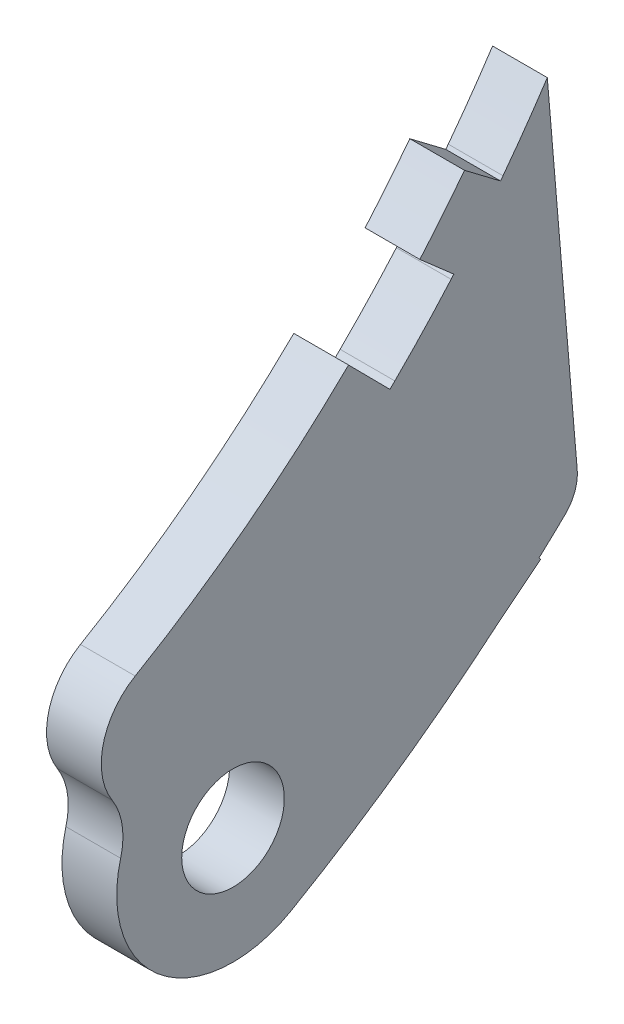
ISO-10303-21;
HEADER;
FILE_DESCRIPTION(('STEP AP214'),'2;1');
FILE_NAME('part.step','',(''),(''),'','','');
FILE_SCHEMA(('AUTOMOTIVE_DESIGN { 1 0 10303 214 1 1 1 1 }'));
ENDSEC;
DATA;
#1=APPLICATION_CONTEXT('core data for automotive mechanical design processes');
#2=APPLICATION_PROTOCOL_DEFINITION('international standard','automotive_design',2000,#1);
#3=PRODUCT_CONTEXT('',#1,'mechanical');
#4=PRODUCT('Part','Part','',(#3));
#5=PRODUCT_RELATED_PRODUCT_CATEGORY('part','',(#4));
#6=PRODUCT_DEFINITION_FORMATION('','',#4);
#7=PRODUCT_DEFINITION_CONTEXT('part definition',#1,'design');
#8=PRODUCT_DEFINITION('design','',#6,#7);
#9=PRODUCT_DEFINITION_SHAPE('','',#8);
#10=(LENGTH_UNIT() NAMED_UNIT(*) SI_UNIT(.MILLI.,.METRE.));
#11=(NAMED_UNIT(*) PLANE_ANGLE_UNIT() SI_UNIT($,.RADIAN.));
#12=(NAMED_UNIT(*) SI_UNIT($,.STERADIAN.) SOLID_ANGLE_UNIT());
#13=UNCERTAINTY_MEASURE_WITH_UNIT(LENGTH_MEASURE(1.E-05),#10,'distance_accuracy_value','');
#14=(GEOMETRIC_REPRESENTATION_CONTEXT(3) GLOBAL_UNCERTAINTY_ASSIGNED_CONTEXT((#13)) GLOBAL_UNIT_ASSIGNED_CONTEXT((#10,
#11,#12)) REPRESENTATION_CONTEXT('',''));
#15=CARTESIAN_POINT('',(0.,0.,0.));
#16=DIRECTION('',(0.,0.,1.));
#17=DIRECTION('',(1.,0.,0.));
#18=AXIS2_PLACEMENT_3D('',#15,#16,#17);
#19=CARTESIAN_POINT('',(-286.81,-73.3959378367008,-42.8723256783574));
#20=DIRECTION('',(1.,0.,0.));
#21=DIRECTION('',(0.,0.,-1.));
#22=AXIS2_PLACEMENT_3D('',#19,#20,#21);
#23=CYLINDRICAL_SURFACE('',#22,5.);
#24=CARTESIAN_POINT('',(-282.81,-73.3959378367008,-42.8723256783574));
#25=DIRECTION('',(-1.,0.,0.));
#26=DIRECTION('',(0.,0.,1.));
#27=AXIS2_PLACEMENT_3D('',#24,#25,#26);
#28=CIRCLE('',#27,5.);
#29=CARTESIAN_POINT('',(-282.81,-76.0957327643658,-38.6638690314909));
#30=VERTEX_POINT('',#29);
#31=CARTESIAN_POINT('',(-282.81,-69.0785297286596,-40.3504241678658));
#32=VERTEX_POINT('',#31);
#33=EDGE_CURVE('E290',#30,#32,#28,.T.);
#34=ORIENTED_EDGE('',*,*,#33,.T.);
#35=DIRECTION('',(1.,0.,0.));
#36=VECTOR('',#35,1.);
#37=CARTESIAN_POINT('',(-286.81,-69.0785297286596,-40.3504241678658));
#38=LINE('',#37,#36);
#39=CARTESIAN_POINT('',(-286.81,-69.0785297286596,-40.3504241678658));
#40=VERTEX_POINT('',#39);
#41=EDGE_CURVE('E314',#40,#32,#38,.T.);
#42=ORIENTED_EDGE('',*,*,#41,.F.);
#43=CARTESIAN_POINT('',(-286.81,-73.3959378367008,-42.8723256783574));
#44=DIRECTION('',(-1.,0.,0.));
#45=DIRECTION('',(0.,0.,1.));
#46=AXIS2_PLACEMENT_3D('',#43,#44,#45);
#47=CIRCLE('',#46,5.);
#48=CARTESIAN_POINT('',(-286.81,-76.0957327643658,-38.663869031491));
#49=VERTEX_POINT('',#48);
#50=EDGE_CURVE('E284',#49,#40,#47,.T.);
#51=ORIENTED_EDGE('',*,*,#50,.F.);
#52=DIRECTION('',(1.,0.,0.));
#53=VECTOR('',#52,1.);
#54=CARTESIAN_POINT('',(-286.81,-76.0957327643658,-38.663869031491));
#55=LINE('',#54,#53);
#56=EDGE_CURVE('E305',#49,#30,#55,.T.);
#57=ORIENTED_EDGE('',*,*,#56,.T.);
#58=EDGE_LOOP('',(#34,#42,#51,#57));
#59=FACE_BOUND('',#58,.T.);
#60=ADVANCED_FACE('F34',(#59),#23,.T.);
#61=CARTESIAN_POINT('',(-286.81,-78.7955276920308,-34.4554123846245));
#62=DIRECTION('',(1.,0.,0.));
#63=DIRECTION('',(0.,0.,-1.));
#64=AXIS2_PLACEMENT_3D('',#61,#62,#63);
#65=CYLINDRICAL_SURFACE('',#64,5.);
#66=CARTESIAN_POINT('',(-282.81,-78.7955276920308,-34.4554123846245));
#67=DIRECTION('',(1.,0.,0.));
#68=DIRECTION('',(0.,0.,1.));
#69=AXIS2_PLACEMENT_3D('',#66,#67,#68);
#70=CIRCLE('',#69,5.);
#71=CARTESIAN_POINT('',(-282.81,-80.0832631244349,-39.2867411310597));
#72=VERTEX_POINT('',#71);
#73=EDGE_CURVE('E235',#72,#30,#70,.T.);
#74=ORIENTED_EDGE('',*,*,#73,.T.);
#75=ORIENTED_EDGE('',*,*,#56,.F.);
#76=CARTESIAN_POINT('',(-286.81,-78.7955276920308,-34.4554123846245));
#77=DIRECTION('',(1.,0.,0.));
#78=DIRECTION('',(0.,0.,1.));
#79=AXIS2_PLACEMENT_3D('',#76,#77,#78);
#80=CIRCLE('',#79,5.);
#81=CARTESIAN_POINT('',(-286.81,-80.0832631244349,-39.2867411310597));
#82=VERTEX_POINT('',#81);
#83=EDGE_CURVE('E287',#82,#49,#80,.T.);
#84=ORIENTED_EDGE('',*,*,#83,.F.);
#85=DIRECTION('',(1.,0.,0.));
#86=VECTOR('',#85,1.);
#87=CARTESIAN_POINT('',(-286.81,-80.0832631244349,-39.2867411310597));
#88=LINE('',#87,#86);
#89=EDGE_CURVE('E239',#82,#72,#88,.T.);
#90=ORIENTED_EDGE('',*,*,#89,.T.);
#91=EDGE_LOOP('',(#74,#75,#84,#90));
#92=FACE_BOUND('',#91,.T.);
#93=ADVANCED_FACE('F306',(#92),#65,.F.);
#94=CARTESIAN_POINT('',(-286.81,-82.272413359522,-47.4999999999995));
#95=DIRECTION('',(1.,0.,0.));
#96=DIRECTION('',(0.,0.,-1.));
#97=AXIS2_PLACEMENT_3D('',#94,#95,#96);
#98=CYLINDRICAL_SURFACE('',#97,8.50000000000001);
#99=CARTESIAN_POINT('',(-282.81,-82.272413359522,-47.4999999999995));
#100=DIRECTION('',(-1.,0.,0.));
#101=DIRECTION('',(0.,0.,1.));
#102=AXIS2_PLACEMENT_3D('',#99,#100,#101);
#103=CIRCLE('',#102,8.50000000000001);
#104=CARTESIAN_POINT('',(-282.81,-89.6336292916897,-51.7499999999995));
#105=VERTEX_POINT('',#104);
#106=EDGE_CURVE('E332',#105,#72,#103,.T.);
#107=ORIENTED_EDGE('',*,*,#106,.T.);
#108=ORIENTED_EDGE('',*,*,#89,.F.);
#109=CARTESIAN_POINT('',(-286.81,-82.272413359522,-47.4999999999995));
#110=DIRECTION('',(-1.,0.,0.));
#111=DIRECTION('',(0.,0.,1.));
#112=AXIS2_PLACEMENT_3D('',#109,#110,#111);
#113=CIRCLE('',#112,8.50000000000001);
#114=CARTESIAN_POINT('',(-286.81,-89.6336292916897,-51.7499999999995));
#115=VERTEX_POINT('',#114);
#116=EDGE_CURVE('E294',#115,#82,#113,.T.);
#117=ORIENTED_EDGE('',*,*,#116,.F.);
#118=DIRECTION('',(1.,0.,0.));
#119=VECTOR('',#118,1.);
#120=CARTESIAN_POINT('',(-286.81,-89.6336292916897,-51.7499999999995));
#121=LINE('',#120,#119);
#122=EDGE_CURVE('E323',#115,#105,#121,.T.);
#123=ORIENTED_EDGE('',*,*,#122,.T.);
#124=EDGE_LOOP('',(#107,#108,#117,#123));
#125=FACE_BOUND('',#124,.T.);
#126=ADVANCED_FACE('F396',(#125),#98,.T.);
#127=CARTESIAN_POINT('',(-286.81,0.,0.));
#128=DIRECTION('',(1.,0.,0.));
#129=DIRECTION('',(0.,0.,-1.));
#130=AXIS2_PLACEMENT_3D('',#127,#128,#129);
#131=CYLINDRICAL_SURFACE('',#130,103.5);
#132=DIRECTION('',(-1.,0.,0.));
#133=VECTOR('',#132,1.);
#134=CARTESIAN_POINT('',(-258.7,-79.0062920010245,-66.8599717637455));
#135=LINE('',#134,#133);
#136=CARTESIAN_POINT('',(-282.81,-79.006292001024,-66.8599717637463));
#137=VERTEX_POINT('',#136);
#138=CARTESIAN_POINT('',(-286.81,-79.006292001024,-66.8599717637463));
#139=VERTEX_POINT('',#138);
#140=EDGE_CURVE('E225',#137,#139,#135,.T.);
#141=ORIENTED_EDGE('',*,*,#140,.F.);
#142=CARTESIAN_POINT('',(-282.81,0.,0.));
#143=DIRECTION('',(-1.,0.,0.));
#144=DIRECTION('',(0.,0.,1.));
#145=AXIS2_PLACEMENT_3D('',#142,#143,#144);
#146=CIRCLE('',#145,103.5);
#147=EDGE_CURVE('E331',#137,#105,#146,.T.);
#148=ORIENTED_EDGE('',*,*,#147,.T.);
#149=ORIENTED_EDGE('',*,*,#122,.F.);
#150=CARTESIAN_POINT('',(-286.81,0.,0.));
#151=DIRECTION('',(-1.,0.,0.));
#152=DIRECTION('',(0.,0.,1.));
#153=AXIS2_PLACEMENT_3D('',#150,#151,#152);
#154=CIRCLE('',#153,103.5);
#155=EDGE_CURVE('E248',#139,#115,#154,.T.);
#156=ORIENTED_EDGE('',*,*,#155,.F.);
#157=EDGE_LOOP('',(#141,#148,#149,#156));
#158=FACE_BOUND('',#157,.T.);
#159=ADVANCED_FACE('F376',(#158),#131,.T.);
#160=CARTESIAN_POINT('',(-392.796966999625,-76.5119213000356,-69.9869694941648));
#161=DIRECTION('',(0.,-0.781749432604839,-0.623592675247243));
#162=DIRECTION('',(0.,0.623592675247243,-0.781749432604839));
#163=AXIS2_PLACEMENT_3D('',#160,#161,#162);
#164=PLANE('',#163);
#165=DIRECTION('',(0.,-0.623592675247243,0.781749432604839));
#166=VECTOR('',#165,1.);
#167=CARTESIAN_POINT('',(-282.81,-79.9487386232164,-65.6785000412519));
#168=LINE('',#167,#166);
#169=CARTESIAN_POINT('',(-282.81,-76.5119213000357,-69.9869694941649));
#170=VERTEX_POINT('',#169);
#171=EDGE_CURVE('E251',#137,#170,#168,.F.);
#172=ORIENTED_EDGE('',*,*,#171,.F.);
#173=ORIENTED_EDGE('',*,*,#140,.T.);
#174=DIRECTION('',(0.,-0.623592675247243,0.781749432604839));
#175=VECTOR('',#174,1.);
#176=CARTESIAN_POINT('',(-286.81,-75.2647359495412,-71.5504683593746));
#177=LINE('',#176,#175);
#178=CARTESIAN_POINT('',(-286.81,-76.5119213000357,-69.9869694941649));
#179=VERTEX_POINT('',#178);
#180=EDGE_CURVE('E245',#179,#139,#177,.T.);
#181=ORIENTED_EDGE('',*,*,#180,.F.);
#182=DIRECTION('',(1.,0.,0.));
#183=VECTOR('',#182,1.);
#184=CARTESIAN_POINT('',(-392.796966999625,-76.5119213000356,-69.9869694941648));
#185=LINE('',#184,#183);
#186=EDGE_CURVE('E227',#179,#170,#185,.T.);
#187=ORIENTED_EDGE('',*,*,#186,.T.);
#188=EDGE_LOOP('',(#172,#173,#181,#187));
#189=FACE_BOUND('',#188,.T.);
#190=ADVANCED_FACE('F372',(#189),#164,.T.);
#191=CARTESIAN_POINT('',(-392.796966999625,-61.073396129291,-57.6718326848965));
#192=DIRECTION('',(0.,0.623592675247241,-0.781749432604841));
#193=DIRECTION('',(0.,0.781749432604841,0.623592675247241));
#194=AXIS2_PLACEMENT_3D('',#191,#192,#193);
#195=PLANE('',#194);
#196=DIRECTION('',(0.,0.781749432604841,0.623592675247241));
#197=VECTOR('',#196,1.);
#198=CARTESIAN_POINT('',(-282.81,-61.073396129291,-57.6718326848965));
#199=LINE('',#198,#197);
#200=CARTESIAN_POINT('',(-282.81,-76.3606536483423,-69.8663050003212));
#201=VERTEX_POINT('',#200);
#202=EDGE_CURVE('E192',#170,#201,#199,.T.);
#203=ORIENTED_EDGE('',*,*,#202,.F.);
#204=ORIENTED_EDGE('',*,*,#186,.F.);
#205=DIRECTION('',(0.,-0.781749432604841,-0.623592675247241));
#206=VECTOR('',#205,1.);
#207=CARTESIAN_POINT('',(-286.81,-61.073396129291,-57.6718326848965));
#208=LINE('',#207,#206);
#209=CARTESIAN_POINT('',(-286.81,-76.3606536483423,-69.8663050003212));
#210=VERTEX_POINT('',#209);
#211=EDGE_CURVE('E243',#210,#179,#208,.T.);
#212=ORIENTED_EDGE('',*,*,#211,.F.);
#213=DIRECTION('',(1.,0.,0.));
#214=VECTOR('',#213,1.);
#215=CARTESIAN_POINT('',(-286.81,-76.3606536483423,-69.8663050003212));
#216=LINE('',#215,#214);
#217=EDGE_CURVE('E228',#210,#201,#216,.T.);
#218=ORIENTED_EDGE('',*,*,#217,.T.);
#219=EDGE_LOOP('',(#203,#204,#212,#218));
#220=FACE_BOUND('',#219,.T.);
#221=ADVANCED_FACE('F370',(#220),#195,.T.);
#222=CARTESIAN_POINT('',(-286.81,-74.5965886279196,-71.7467697187612));
#223=VERTEX_POINT('',#222);
#224=EDGE_CURVE('E246',#223,#210,#154,.T.);
#225=ORIENTED_EDGE('',*,*,#224,.F.);
#226=DIRECTION('',(1.,0.,0.));
#227=VECTOR('',#226,1.);
#228=CARTESIAN_POINT('',(-286.81,-74.5965886279196,-71.7467697187611));
#229=LINE('',#228,#227);
#230=CARTESIAN_POINT('',(-282.81,-74.5965886279196,-71.7467697187612));
#231=VERTEX_POINT('',#230);
#232=EDGE_CURVE('E311',#223,#231,#229,.T.);
#233=ORIENTED_EDGE('',*,*,#232,.T.);
#234=EDGE_CURVE('E329',#231,#201,#146,.T.);
#235=ORIENTED_EDGE('',*,*,#234,.T.);
#236=ORIENTED_EDGE('',*,*,#217,.F.);
#237=EDGE_LOOP('',(#225,#233,#235,#236));
#238=FACE_BOUND('',#237,.T.);
#239=ADVANCED_FACE('F367',(#238),#131,.T.);
#240=CARTESIAN_POINT('',(-286.81,-72.43436866769,-69.6671532051739));
#241=DIRECTION('',(1.,0.,0.));
#242=DIRECTION('',(0.,0.,-1.));
#243=AXIS2_PLACEMENT_3D('',#240,#241,#242);
#244=CYLINDRICAL_SURFACE('',#243,3.);
#245=CARTESIAN_POINT('',(-286.81,-72.43436866769,-69.6671532051739));
#246=DIRECTION('',(1.,0.,0.));
#247=DIRECTION('',(0.,0.,-1.));
#248=AXIS2_PLACEMENT_3D('',#245,#246,#247);
#249=CIRCLE('',#248,3.);
#250=CARTESIAN_POINT('',(-286.81,-72.1822694264871,-72.6565421013506));
#251=VERTEX_POINT('',#250);
#252=EDGE_CURVE('E292',#251,#223,#249,.F.);
#253=ORIENTED_EDGE('',*,*,#252,.F.);
#254=DIRECTION('',(1.,0.,0.));
#255=VECTOR('',#254,1.);
#256=CARTESIAN_POINT('',(-286.81,-72.1822694264871,-72.6565421013506));
#257=LINE('',#256,#255);
#258=CARTESIAN_POINT('',(-282.81,-72.1822694264871,-72.6565421013506));
#259=VERTEX_POINT('',#258);
#260=EDGE_CURVE('E255',#259,#251,#257,.F.);
#261=ORIENTED_EDGE('',*,*,#260,.F.);
#262=CARTESIAN_POINT('',(-282.81,-72.43436866769,-69.6671532051739));
#263=DIRECTION('',(1.,0.,0.));
#264=DIRECTION('',(0.,0.,-1.));
#265=AXIS2_PLACEMENT_3D('',#262,#263,#264);
#266=CIRCLE('',#265,3.);
#267=EDGE_CURVE('E186',#231,#259,#266,.T.);
#268=ORIENTED_EDGE('',*,*,#267,.F.);
#269=ORIENTED_EDGE('',*,*,#232,.F.);
#270=EDGE_LOOP('',(#253,#261,#268,#269));
#271=FACE_BOUND('',#270,.T.);
#272=ADVANCED_FACE('F362',(#271),#244,.T.);
#273=CARTESIAN_POINT('',(-286.81,-45.7781275192469,-70.4298448161826));
#274=DIRECTION('',(0.,-0.0840330804009582,0.996462965392256));
#275=DIRECTION('',(0.,-0.996462965392256,-0.0840330804009582));
#276=AXIS2_PLACEMENT_3D('',#273,#274,#275);
#277=PLANE('',#276);
#278=DIRECTION('',(0.,-0.996462965392256,-0.0840330804009584));
#279=VECTOR('',#278,1.);
#280=CARTESIAN_POINT('',(-286.81,-45.7781275192469,-70.4298448161826));
#281=LINE('',#280,#279);
#282=CARTESIAN_POINT('',(-286.81,-46.2639612951835,-70.4708158408696));
#283=VERTEX_POINT('',#282);
#284=EDGE_CURVE('E258',#283,#251,#281,.T.);
#285=ORIENTED_EDGE('',*,*,#284,.F.);
#286=DIRECTION('',(1.,0.,0.));
#287=VECTOR('',#286,1.);
#288=CARTESIAN_POINT('',(-333.198032184288,-46.2639612951835,-70.4708158408696));
#289=LINE('',#288,#287);
#290=CARTESIAN_POINT('',(-282.81,-46.2639612951835,-70.4708158408696));
#291=VERTEX_POINT('',#290);
#292=EDGE_CURVE('E328',#283,#291,#289,.T.);
#293=ORIENTED_EDGE('',*,*,#292,.T.);
#294=DIRECTION('',(0.,-0.996462965392256,-0.0840330804009584));
#295=VECTOR('',#294,1.);
#296=CARTESIAN_POINT('',(-282.81,-45.7781275192469,-70.4298448161826));
#297=LINE('',#296,#295);
#298=EDGE_CURVE('E326',#291,#259,#297,.T.);
#299=ORIENTED_EDGE('',*,*,#298,.T.);
#300=ORIENTED_EDGE('',*,*,#260,.T.);
#301=EDGE_LOOP('',(#285,#293,#299,#300));
#302=FACE_BOUND('',#301,.T.);
#303=ADVANCED_FACE('F356',(#302),#277,.F.);
#304=CARTESIAN_POINT('',(-333.198032184288,0.,0.));
#305=DIRECTION('',(1.,0.,0.));
#306=DIRECTION('',(0.,0.,-1.));
#307=AXIS2_PLACEMENT_3D('',#304,#305,#306);
#308=CYLINDRICAL_SURFACE('',#307,84.3);
#309=CARTESIAN_POINT('',(-282.81,0.,0.));
#310=DIRECTION('',(1.,0.,0.));
#311=DIRECTION('',(0.,0.,-1.));
#312=AXIS2_PLACEMENT_3D('',#309,#310,#311);
#313=CIRCLE('',#312,84.3);
#314=CARTESIAN_POINT('',(-282.81,-50.8569549756148,-67.2313924488277));
#315=VERTEX_POINT('',#314);
#316=EDGE_CURVE('E224',#315,#291,#313,.T.);
#317=ORIENTED_EDGE('',*,*,#316,.T.);
#318=ORIENTED_EDGE('',*,*,#292,.F.);
#319=CARTESIAN_POINT('',(-286.81,0.,0.));
#320=DIRECTION('',(1.,0.,0.));
#321=DIRECTION('',(0.,0.,-1.));
#322=AXIS2_PLACEMENT_3D('',#319,#320,#321);
#323=CIRCLE('',#322,84.3);
#324=CARTESIAN_POINT('',(-286.81,-50.8569549756145,-67.2313924488279));
#325=VERTEX_POINT('',#324);
#326=EDGE_CURVE('E206',#325,#283,#323,.T.);
#327=ORIENTED_EDGE('',*,*,#326,.F.);
#328=DIRECTION('',(1.,0.,0.));
#329=VECTOR('',#328,1.);
#330=CARTESIAN_POINT('',(-333.198032184288,-50.8569549756148,-67.2313924488277));
#331=LINE('',#330,#329);
#332=EDGE_CURVE('E221',#325,#315,#331,.T.);
#333=ORIENTED_EDGE('',*,*,#332,.T.);
#334=EDGE_LOOP('',(#317,#318,#327,#333));
#335=FACE_BOUND('',#334,.T.);
#336=ADVANCED_FACE('F353',(#335),#308,.F.);
#337=CARTESIAN_POINT('',(-282.51,-51.0962125999876,-67.0504068439325));
#338=DIRECTION('',(0.,-0.603285349651418,-0.797525414576844));
#339=DIRECTION('',(0.,0.797525414576844,-0.603285349651418));
#340=AXIS2_PLACEMENT_3D('',#337,#338,#339);
#341=PLANE('',#340);
#342=DIRECTION('',(0.,0.797525414576844,-0.603285349651418));
#343=VECTOR('',#342,1.);
#344=CARTESIAN_POINT('',(-282.81,-76.9128119041753,-47.5215293268427));
#345=LINE('',#344,#343);
#346=CARTESIAN_POINT('',(-282.81,-51.0962125999876,-67.0504068439325));
#347=VERTEX_POINT('',#346);
#348=EDGE_CURVE('E184',#347,#315,#345,.T.);
#349=ORIENTED_EDGE('',*,*,#348,.T.);
#350=ORIENTED_EDGE('',*,*,#332,.F.);
#351=DIRECTION('',(0.,0.797525414576844,-0.603285349651418));
#352=VECTOR('',#351,1.);
#353=CARTESIAN_POINT('',(-286.81,-76.9128119041753,-47.5215293268427));
#354=LINE('',#353,#352);
#355=CARTESIAN_POINT('',(-286.81,-51.0962125999876,-67.0504068439325));
#356=VERTEX_POINT('',#355);
#357=EDGE_CURVE('E203',#356,#325,#354,.T.);
#358=ORIENTED_EDGE('',*,*,#357,.F.);
#359=DIRECTION('',(-1.,0.,0.));
#360=VECTOR('',#359,1.);
#361=CARTESIAN_POINT('',(-282.51,-51.0962125999876,-67.0504068439325));
#362=LINE('',#361,#360);
#363=EDGE_CURVE('E200',#347,#356,#362,.T.);
#364=ORIENTED_EDGE('',*,*,#363,.F.);
#365=EDGE_LOOP('',(#349,#350,#358,#364));
#366=FACE_BOUND('',#365,.T.);
#367=ADVANCED_FACE('F414',(#366),#341,.F.);
#368=CARTESIAN_POINT('',(0.,-0.23925762437299,0.180985604895482));
#369=DIRECTION('',(0.,0.797525414576844,-0.603285349651419));
#370=DIRECTION('',(0.,0.603285349651419,0.797525414576844));
#371=AXIS2_PLACEMENT_3D('',#368,#369,#370);
#372=PLANE('',#371);
#373=DIRECTION('',(-1.,0.,0.));
#374=VECTOR('',#373,1.);
#375=CARTESIAN_POINT('',(-258.7,-49.1050357864609,-64.4181299046347));
#376=LINE('',#375,#374);
#377=CARTESIAN_POINT('',(-282.81,-49.1050357864609,-64.4181299046347));
#378=VERTEX_POINT('',#377);
#379=CARTESIAN_POINT('',(-286.81,-49.1050357864609,-64.4181299046347));
#380=VERTEX_POINT('',#379);
#381=EDGE_CURVE('E164',#378,#380,#376,.T.);
#382=ORIENTED_EDGE('',*,*,#381,.F.);
#383=DIRECTION('',(0.,0.603285349651419,0.797525414576844));
#384=VECTOR('',#383,1.);
#385=CARTESIAN_POINT('',(-282.81,-47.5793385325131,-62.4012031954472));
#386=LINE('',#385,#384);
#387=EDGE_CURVE('E174',#347,#378,#386,.T.);
#388=ORIENTED_EDGE('',*,*,#387,.F.);
#389=ORIENTED_EDGE('',*,*,#363,.T.);
#390=DIRECTION('',(0.,0.603285349651419,0.797525414576844));
#391=VECTOR('',#390,1.);
#392=CARTESIAN_POINT('',(-286.81,-47.5793385325131,-62.4012031954472));
#393=LINE('',#392,#391);
#394=EDGE_CURVE('E177',#356,#380,#393,.T.);
#395=ORIENTED_EDGE('',*,*,#394,.T.);
#396=EDGE_LOOP('',(#382,#388,#389,#395));
#397=FACE_BOUND('',#396,.T.);
#398=ADVANCED_FACE('F172',(#397),#372,.T.);
#399=CARTESIAN_POINT('',(0.,0.225765940853245,-0.19755945927908));
#400=DIRECTION('',(0.,0.752553136177329,-0.658531530930501));
#401=DIRECTION('',(0.,0.658531530930501,0.752553136177329));
#402=AXIS2_PLACEMENT_3D('',#399,#400,#401);
#403=PLANE('',#402);
#404=DIRECTION('',(0.,0.658531530930501,0.752553136177329));
#405=VECTOR('',#404,1.);
#406=CARTESIAN_POINT('',(-282.81,-52.8500595199353,-60.8512670338862));
#407=LINE('',#406,#405);
#408=CARTESIAN_POINT('',(-282.81,-55.2884421165879,-63.6377888390279));
#409=VERTEX_POINT('',#408);
#410=CARTESIAN_POINT('',(-282.81,-53.1149222124121,-61.1539454031333));
#411=VERTEX_POINT('',#410);
#412=EDGE_CURVE('E208',#409,#411,#407,.T.);
#413=ORIENTED_EDGE('',*,*,#412,.T.);
#414=DIRECTION('',(-1.,0.,0.));
#415=VECTOR('',#414,1.);
#416=CARTESIAN_POINT('',(-258.7,-53.1149222124121,-61.1539454031333));
#417=LINE('',#416,#415);
#418=CARTESIAN_POINT('',(-286.81,-53.1149222124121,-61.1539454031333));
#419=VERTEX_POINT('',#418);
#420=EDGE_CURVE('E48',#411,#419,#417,.T.);
#421=ORIENTED_EDGE('',*,*,#420,.T.);
#422=DIRECTION('',(0.,0.658531530930501,0.752553136177329));
#423=VECTOR('',#422,1.);
#424=CARTESIAN_POINT('',(-286.81,-52.8500595199353,-60.8512670338862));
#425=LINE('',#424,#423);
#426=CARTESIAN_POINT('',(-286.81,-55.2884421165879,-63.6377888390279));
#427=VERTEX_POINT('',#426);
#428=EDGE_CURVE('E56',#427,#419,#425,.T.);
#429=ORIENTED_EDGE('',*,*,#428,.F.);
#430=DIRECTION('',(1.,0.,0.));
#431=VECTOR('',#430,1.);
#432=CARTESIAN_POINT('',(-282.51,-55.2884421165879,-63.6377888390279));
#433=LINE('',#432,#431);
#434=EDGE_CURVE('E42',#427,#409,#433,.T.);
#435=ORIENTED_EDGE('',*,*,#434,.T.);
#436=EDGE_LOOP('',(#413,#421,#429,#435));
#437=FACE_BOUND('',#436,.T.);
#438=ADVANCED_FACE('F348',(#437),#403,.F.);
#439=CARTESIAN_POINT('',(-282.51,-55.2884421165879,-63.6377888390279));
#440=DIRECTION('',(0.,-0.658531530930501,-0.752553136177329));
#441=DIRECTION('',(0.,0.752553136177329,-0.658531530930501));
#442=AXIS2_PLACEMENT_3D('',#439,#440,#441);
#443=PLANE('',#442);
#444=DIRECTION('',(0.,0.752553136177329,-0.658531530930501));
#445=VECTOR('',#444,1.);
#446=CARTESIAN_POINT('',(-282.81,-75.8343204333535,-45.6588474834992));
#447=LINE('',#446,#445);
#448=CARTESIAN_POINT('',(-282.81,-55.5142080574411,-63.4402293797487));
#449=VERTEX_POINT('',#448);
#450=EDGE_CURVE('E199',#449,#409,#447,.T.);
#451=ORIENTED_EDGE('',*,*,#450,.T.);
#452=ORIENTED_EDGE('',*,*,#434,.F.);
#453=DIRECTION('',(0.,0.752553136177329,-0.658531530930501));
#454=VECTOR('',#453,1.);
#455=CARTESIAN_POINT('',(-286.81,-75.8343204333535,-45.6588474834991));
#456=LINE('',#455,#454);
#457=CARTESIAN_POINT('',(-286.81,-55.5142080574395,-63.4402293797502));
#458=VERTEX_POINT('',#457);
#459=EDGE_CURVE('E212',#458,#427,#456,.T.);
#460=ORIENTED_EDGE('',*,*,#459,.F.);
#461=DIRECTION('',(1.,0.,0.));
#462=VECTOR('',#461,1.);
#463=CARTESIAN_POINT('',(-333.198032184288,-55.5142080574395,-63.4402293797502));
#464=LINE('',#463,#462);
#465=EDGE_CURVE('E210',#458,#449,#464,.T.);
#466=ORIENTED_EDGE('',*,*,#465,.T.);
#467=EDGE_LOOP('',(#451,#452,#460,#466));
#468=FACE_BOUND('',#467,.T.);
#469=ADVANCED_FACE('F413',(#468),#443,.F.);
#470=CARTESIAN_POINT('',(-286.81,-82.272413359522,-47.4999999999995));
#471=DIRECTION('',(1.,0.,0.));
#472=DIRECTION('',(0.,0.,-1.));
#473=AXIS2_PLACEMENT_3D('',#470,#471,#472);
#474=CYLINDRICAL_SURFACE('',#473,3.75000000000001);
#475=CARTESIAN_POINT('',(-286.81,-82.272413359522,-47.4999999999995));
#476=DIRECTION('',(-1.,0.,0.));
#477=DIRECTION('',(0.,0.,1.));
#478=AXIS2_PLACEMENT_3D('',#475,#476,#477);
#479=CIRCLE('',#478,3.75000000000001);
#480=CARTESIAN_POINT('',(-286.81,-82.272413359522,-43.7499999999995));
#481=VERTEX_POINT('',#480);
#482=EDGE_CURVE('E230',#481,#481,#479,.T.);
#483=ORIENTED_EDGE('',*,*,#482,.T.);
#484=EDGE_LOOP('',(#483));
#485=FACE_BOUND('',#484,.T.);
#486=CARTESIAN_POINT('',(-282.81,-82.272413359522,-47.4999999999995));
#487=DIRECTION('',(-1.,0.,0.));
#488=DIRECTION('',(0.,0.,1.));
#489=AXIS2_PLACEMENT_3D('',#486,#487,#488);
#490=CIRCLE('',#489,3.75000000000001);
#491=CARTESIAN_POINT('',(-282.81,-82.272413359522,-43.7499999999995));
#492=VERTEX_POINT('',#491);
#493=EDGE_CURVE('E185',#492,#492,#490,.T.);
#494=ORIENTED_EDGE('',*,*,#493,.F.);
#495=EDGE_LOOP('',(#494));
#496=FACE_BOUND('',#495,.T.);
#497=ADVANCED_FACE('F410',(#485,#496),#474,.F.);
#498=CARTESIAN_POINT('',(-333.198032184288,0.,0.));
#499=DIRECTION('',(1.,0.,0.));
#500=DIRECTION('',(0.,0.,-1.));
#501=AXIS2_PLACEMENT_3D('',#498,#499,#500);
#502=CYLINDRICAL_SURFACE('',#501,84.3);
#503=CARTESIAN_POINT('',(-282.81,0.,0.));
#504=DIRECTION('',(1.,0.,0.));
#505=DIRECTION('',(0.,0.,-1.));
#506=AXIS2_PLACEMENT_3D('',#503,#504,#505);
#507=CIRCLE('',#506,84.3);
#508=CARTESIAN_POINT('',(-282.81,-59.889746164842,-59.327129580916));
#509=VERTEX_POINT('',#508);
#510=EDGE_CURVE('E220',#509,#449,#507,.T.);
#511=ORIENTED_EDGE('',*,*,#510,.T.);
#512=ORIENTED_EDGE('',*,*,#465,.F.);
#513=CARTESIAN_POINT('',(-286.81,0.,0.));
#514=DIRECTION('',(1.,0.,0.));
#515=DIRECTION('',(0.,0.,-1.));
#516=AXIS2_PLACEMENT_3D('',#513,#514,#515);
#517=CIRCLE('',#516,84.3);
#518=CARTESIAN_POINT('',(-286.81,-59.889746164842,-59.327129580916));
#519=VERTEX_POINT('',#518);
#520=EDGE_CURVE('E189',#519,#458,#517,.T.);
#521=ORIENTED_EDGE('',*,*,#520,.F.);
#522=DIRECTION('',(1.,0.,0.));
#523=VECTOR('',#522,1.);
#524=CARTESIAN_POINT('',(-333.198032184288,-59.889746164842,-59.327129580916));
#525=LINE('',#524,#523);
#526=EDGE_CURVE('E218',#519,#509,#525,.T.);
#527=ORIENTED_EDGE('',*,*,#526,.T.);
#528=EDGE_LOOP('',(#511,#512,#521,#527));
#529=FACE_BOUND('',#528,.T.);
#530=ADVANCED_FACE('F275',(#529),#502,.F.);
#531=CARTESIAN_POINT('',(-333.198032184288,-59.8897461648419,-59.327129580916));
#532=DIRECTION('',(0.,-0.71043589756631,-0.70376191673687));
#533=DIRECTION('',(0.,0.70376191673687,-0.71043589756631));
#534=AXIS2_PLACEMENT_3D('',#531,#532,#533);
#535=PLANE('',#534);
#536=DIRECTION('',(0.,0.70376191673687,-0.71043589756631));
#537=VECTOR('',#536,1.);
#538=CARTESIAN_POINT('',(-282.81,-74.8061395459927,-44.2692796629697));
#539=LINE('',#538,#537);
#540=CARTESIAN_POINT('',(-282.81,-60.2446657529211,-58.9688441862047));
#541=VERTEX_POINT('',#540);
#542=EDGE_CURVE('E202',#541,#509,#539,.T.);
#543=ORIENTED_EDGE('',*,*,#542,.T.);
#544=ORIENTED_EDGE('',*,*,#526,.F.);
#545=DIRECTION('',(0.,0.70376191673687,-0.71043589756631));
#546=VECTOR('',#545,1.);
#547=CARTESIAN_POINT('',(-286.81,-74.8061395459927,-44.2692796629697));
#548=LINE('',#547,#546);
#549=CARTESIAN_POINT('',(-286.81,-60.2446657529211,-58.9688441862047));
#550=VERTEX_POINT('',#549);
#551=EDGE_CURVE('E196',#550,#519,#548,.T.);
#552=ORIENTED_EDGE('',*,*,#551,.F.);
#553=DIRECTION('',(-1.,0.,0.));
#554=VECTOR('',#553,1.);
#555=CARTESIAN_POINT('',(-287.11,-60.2446657529211,-58.9688441862047));
#556=LINE('',#555,#554);
#557=EDGE_CURVE('E269',#541,#550,#556,.T.);
#558=ORIENTED_EDGE('',*,*,#557,.F.);
#559=EDGE_LOOP('',(#543,#544,#552,#558));
#560=FACE_BOUND('',#559,.T.);
#561=ADVANCED_FACE('F36',(#560),#535,.F.);
#562=CARTESIAN_POINT('',(-286.81,-73.3959378367008,-42.8723256783574));
#563=DIRECTION('',(1.,0.,0.));
#564=DIRECTION('',(0.,0.,1.));
#565=AXIS2_PLACEMENT_3D('',#562,#563,#564);
#566=PLANE('',#565);
#567=ORIENTED_EDGE('',*,*,#482,.F.);
#568=EDGE_LOOP('',(#567));
#569=FACE_BOUND('',#568,.T.);
#570=ORIENTED_EDGE('',*,*,#428,.T.);
#571=CARTESIAN_POINT('',(-286.81,0.,0.));
#572=DIRECTION('',(1.,0.,0.));
#573=DIRECTION('',(0.,0.,-1.));
#574=AXIS2_PLACEMENT_3D('',#571,#572,#573);
#575=CIRCLE('',#574,81.);
#576=EDGE_CURVE('E178',#419,#380,#575,.T.);
#577=ORIENTED_EDGE('',*,*,#576,.T.);
#578=ORIENTED_EDGE('',*,*,#394,.F.);
#579=ORIENTED_EDGE('',*,*,#357,.T.);
#580=ORIENTED_EDGE('',*,*,#326,.T.);
#581=ORIENTED_EDGE('',*,*,#284,.T.);
#582=ORIENTED_EDGE('',*,*,#252,.T.);
#583=ORIENTED_EDGE('',*,*,#224,.T.);
#584=ORIENTED_EDGE('',*,*,#211,.T.);
#585=ORIENTED_EDGE('',*,*,#180,.T.);
#586=ORIENTED_EDGE('',*,*,#155,.T.);
#587=ORIENTED_EDGE('',*,*,#116,.T.);
#588=ORIENTED_EDGE('',*,*,#83,.T.);
#589=ORIENTED_EDGE('',*,*,#50,.T.);
#590=CARTESIAN_POINT('',(-286.81,0.,0.));
#591=DIRECTION('',(1.,0.,0.));
#592=DIRECTION('',(0.,0.,1.));
#593=AXIS2_PLACEMENT_3D('',#590,#591,#592);
#594=CIRCLE('',#593,80.);
#595=CARTESIAN_POINT('',(-286.81,-57.1886620717621,-55.9415492316918));
#596=VERTEX_POINT('',#595);
#597=EDGE_CURVE('E281',#40,#596,#594,.T.);
#598=ORIENTED_EDGE('',*,*,#597,.T.);
#599=DIRECTION('',(0.,-0.710435897566324,-0.703761916736856));
#600=VECTOR('',#599,1.);
#601=CARTESIAN_POINT('',(-286.81,-58.8344640436295,-57.5718902015927));
#602=LINE('',#601,#600);
#603=EDGE_CURVE('E280',#596,#550,#602,.T.);
#604=ORIENTED_EDGE('',*,*,#603,.T.);
#605=ORIENTED_EDGE('',*,*,#551,.T.);
#606=ORIENTED_EDGE('',*,*,#520,.T.);
#607=ORIENTED_EDGE('',*,*,#459,.T.);
#608=EDGE_LOOP('',(#570,#577,#578,#579,#580,#581,#582,#583,#584,#585,#586,#587,#588,#589,#598,
#604,#605,#606,#607));
#609=FACE_BOUND('',#608,.T.);
#610=ADVANCED_FACE('F277',(#569,#609),#566,.F.);
#611=CARTESIAN_POINT('',(-282.81,-73.3959378367008,-42.8723256783574));
#612=DIRECTION('',(1.,0.,0.));
#613=DIRECTION('',(0.,0.,1.));
#614=AXIS2_PLACEMENT_3D('',#611,#612,#613);
#615=PLANE('',#614);
#616=CARTESIAN_POINT('',(-282.81,0.,0.));
#617=DIRECTION('',(1.,0.,0.));
#618=DIRECTION('',(0.,0.,-1.));
#619=AXIS2_PLACEMENT_3D('',#616,#617,#618);
#620=CIRCLE('',#619,81.);
#621=EDGE_CURVE('E11',#411,#378,#620,.T.);
#622=ORIENTED_EDGE('',*,*,#621,.F.);
#623=ORIENTED_EDGE('',*,*,#412,.F.);
#624=ORIENTED_EDGE('',*,*,#450,.F.);
#625=ORIENTED_EDGE('',*,*,#510,.F.);
#626=ORIENTED_EDGE('',*,*,#542,.F.);
#627=DIRECTION('',(0.,-0.710435897566324,-0.703761916736856));
#628=VECTOR('',#627,1.);
#629=CARTESIAN_POINT('',(-282.81,-58.8344640436295,-57.5718902015927));
#630=LINE('',#629,#628);
#631=CARTESIAN_POINT('',(-282.81,-57.1886620717621,-55.9415492316918));
#632=VERTEX_POINT('',#631);
#633=EDGE_CURVE('E317',#632,#541,#630,.T.);
#634=ORIENTED_EDGE('',*,*,#633,.F.);
#635=CARTESIAN_POINT('',(-282.81,0.,0.));
#636=DIRECTION('',(1.,0.,0.));
#637=DIRECTION('',(0.,0.,1.));
#638=AXIS2_PLACEMENT_3D('',#635,#636,#637);
#639=CIRCLE('',#638,80.);
#640=EDGE_CURVE('E253',#32,#632,#639,.T.);
#641=ORIENTED_EDGE('',*,*,#640,.F.);
#642=ORIENTED_EDGE('',*,*,#33,.F.);
#643=ORIENTED_EDGE('',*,*,#73,.F.);
#644=ORIENTED_EDGE('',*,*,#106,.F.);
#645=ORIENTED_EDGE('',*,*,#147,.F.);
#646=ORIENTED_EDGE('',*,*,#171,.T.);
#647=ORIENTED_EDGE('',*,*,#202,.T.);
#648=ORIENTED_EDGE('',*,*,#234,.F.);
#649=ORIENTED_EDGE('',*,*,#267,.T.);
#650=ORIENTED_EDGE('',*,*,#298,.F.);
#651=ORIENTED_EDGE('',*,*,#316,.F.);
#652=ORIENTED_EDGE('',*,*,#348,.F.);
#653=ORIENTED_EDGE('',*,*,#387,.T.);
#654=EDGE_LOOP('',(#622,#623,#624,#625,#626,#634,#641,#642,#643,#644,#645,#646,#647,#648,#649,
#650,#651,#652,#653));
#655=FACE_BOUND('',#654,.T.);
#656=ORIENTED_EDGE('',*,*,#493,.T.);
#657=EDGE_LOOP('',(#656));
#658=FACE_BOUND('',#657,.T.);
#659=ADVANCED_FACE('F181',(#655,#658),#615,.T.);
#660=CARTESIAN_POINT('',(-258.7,0.,0.));
#661=DIRECTION('',(-1.,0.,0.));
#662=DIRECTION('',(0.,0.,1.));
#663=AXIS2_PLACEMENT_3D('',#660,#661,#662);
#664=CYLINDRICAL_SURFACE('',#663,80.);
#665=DIRECTION('',(-1.,0.,0.));
#666=VECTOR('',#665,1.);
#667=CARTESIAN_POINT('',(-258.7,-57.1886620717621,-55.9415492316918));
#668=LINE('',#667,#666);
#669=EDGE_CURVE('E320',#596,#632,#668,.F.);
#670=ORIENTED_EDGE('',*,*,#669,.F.);
#671=ORIENTED_EDGE('',*,*,#597,.F.);
#672=ORIENTED_EDGE('',*,*,#41,.T.);
#673=ORIENTED_EDGE('',*,*,#640,.T.);
#674=EDGE_LOOP('',(#670,#671,#672,#673));
#675=FACE_BOUND('',#674,.T.);
#676=ADVANCED_FACE('F379',(#675),#664,.F.);
#677=CARTESIAN_POINT('',(0.,-0.354919588079955,0.358285394712242));
#678=DIRECTION('',(0.,-0.703761916736856,0.710435897566324));
#679=DIRECTION('',(0.,-0.710435897566324,-0.703761916736856));
#680=AXIS2_PLACEMENT_3D('',#677,#678,#679);
#681=PLANE('',#680);
#682=ORIENTED_EDGE('',*,*,#633,.T.);
#683=ORIENTED_EDGE('',*,*,#557,.T.);
#684=ORIENTED_EDGE('',*,*,#603,.F.);
#685=ORIENTED_EDGE('',*,*,#669,.T.);
#686=EDGE_LOOP('',(#682,#683,#684,#685));
#687=FACE_BOUND('',#686,.T.);
#688=ADVANCED_FACE('F381',(#687),#681,.F.);
#689=CARTESIAN_POINT('',(-258.7,0.,0.));
#690=DIRECTION('',(-1.,0.,0.));
#691=DIRECTION('',(0.,0.,1.));
#692=AXIS2_PLACEMENT_3D('',#689,#690,#691);
#693=CYLINDRICAL_SURFACE('',#692,81.);
#694=ORIENTED_EDGE('',*,*,#420,.F.);
#695=ORIENTED_EDGE('',*,*,#621,.T.);
#696=ORIENTED_EDGE('',*,*,#381,.T.);
#697=ORIENTED_EDGE('',*,*,#576,.F.);
#698=EDGE_LOOP('',(#694,#695,#696,#697));
#699=FACE_BOUND('',#698,.T.);
#700=ADVANCED_FACE('F163',(#699),#693,.F.);
#701=CLOSED_SHELL('',(#60,#93,#126,#159,#190,#221,#239,#272,#303,#336,#367,#398,#438,#469,#497,
#530,#561,#610,#659,#676,#688,#700));
#702=MANIFOLD_SOLID_BREP('B2',#701);
#703=ADVANCED_BREP_SHAPE_REPRESENTATION('',(#18,#702),#14);
#704=SHAPE_DEFINITION_REPRESENTATION(#9,#703);
ENDSEC;
END-ISO-10303-21;
